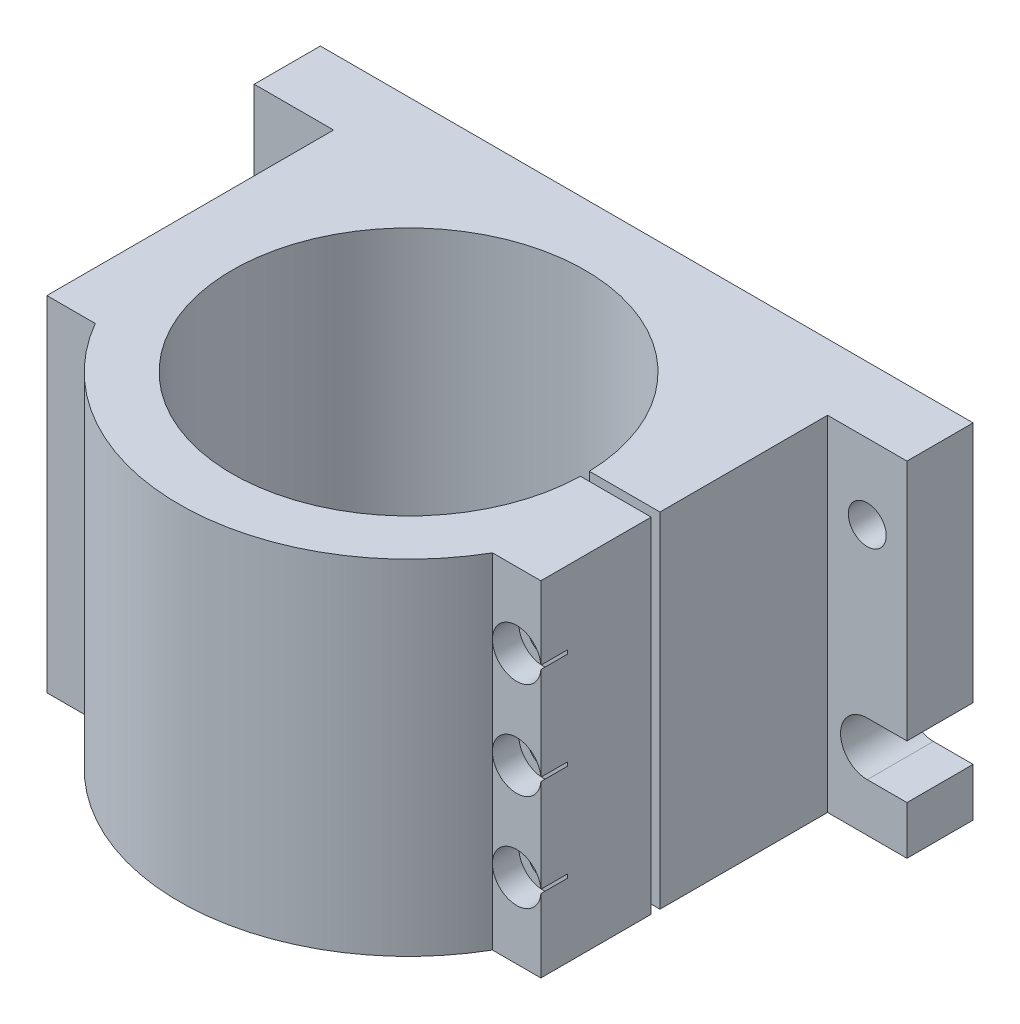
ISO-10303-21;
HEADER;
FILE_DESCRIPTION(('STEP AP214'),'2;1');
FILE_NAME('part.step','',(''),(''),'','','');
FILE_SCHEMA(('AUTOMOTIVE_DESIGN { 1 0 10303 214 1 1 1 1 }'));
ENDSEC;
DATA;
#1=APPLICATION_CONTEXT('core data for automotive mechanical design processes');
#2=APPLICATION_PROTOCOL_DEFINITION('international standard','automotive_design',2000,#1);
#3=PRODUCT_CONTEXT('',#1,'mechanical');
#4=PRODUCT('Part','Part','',(#3));
#5=PRODUCT_RELATED_PRODUCT_CATEGORY('part','',(#4));
#6=PRODUCT_DEFINITION_FORMATION('','',#4);
#7=PRODUCT_DEFINITION_CONTEXT('part definition',#1,'design');
#8=PRODUCT_DEFINITION('design','',#6,#7);
#9=PRODUCT_DEFINITION_SHAPE('','',#8);
#10=(LENGTH_UNIT() NAMED_UNIT(*) SI_UNIT(.MILLI.,.METRE.));
#11=(NAMED_UNIT(*) PLANE_ANGLE_UNIT() SI_UNIT($,.RADIAN.));
#12=(NAMED_UNIT(*) SI_UNIT($,.STERADIAN.) SOLID_ANGLE_UNIT());
#13=UNCERTAINTY_MEASURE_WITH_UNIT(LENGTH_MEASURE(1.E-05),#10,'distance_accuracy_value','');
#14=(GEOMETRIC_REPRESENTATION_CONTEXT(3) GLOBAL_UNCERTAINTY_ASSIGNED_CONTEXT((#13)) GLOBAL_UNIT_ASSIGNED_CONTEXT((#10,
#11,#12)) REPRESENTATION_CONTEXT('',''));
#15=CARTESIAN_POINT('',(0.,0.,0.));
#16=DIRECTION('',(0.,0.,1.));
#17=DIRECTION('',(1.,0.,0.));
#18=AXIS2_PLACEMENT_3D('',#15,#16,#17);
#19=CARTESIAN_POINT('',(74.,39.,-54.));
#20=DIRECTION('',(-1.,0.,0.));
#21=DIRECTION('',(0.,0.,1.));
#22=AXIS2_PLACEMENT_3D('',#19,#20,#21);
#23=PLANE('',#22);
#24=DIRECTION('',(0.,-1.,0.));
#25=VECTOR('',#24,1.);
#26=CARTESIAN_POINT('',(74.,39.,-39.));
#27=LINE('',#26,#25);
#28=CARTESIAN_POINT('',(74.,39.,-39.));
#29=VERTEX_POINT('',#28);
#30=CARTESIAN_POINT('',(74.,-15.95,-39.));
#31=VERTEX_POINT('',#30);
#32=EDGE_CURVE('E399',#29,#31,#27,.T.);
#33=ORIENTED_EDGE('',*,*,#32,.T.);
#34=DIRECTION('',(0.,0.,1.));
#35=VECTOR('',#34,1.);
#36=CARTESIAN_POINT('',(74.,-15.95,-54.001));
#37=LINE('',#36,#35);
#38=CARTESIAN_POINT('',(74.,-15.95,-54.));
#39=VERTEX_POINT('',#38);
#40=EDGE_CURVE('E250',#39,#31,#37,.T.);
#41=ORIENTED_EDGE('',*,*,#40,.F.);
#42=DIRECTION('',(0.,-1.,0.));
#43=VECTOR('',#42,1.);
#44=CARTESIAN_POINT('',(74.,39.,-54.));
#45=LINE('',#44,#43);
#46=CARTESIAN_POINT('',(74.,39.,-54.));
#47=VERTEX_POINT('',#46);
#48=EDGE_CURVE('E396',#47,#39,#45,.T.);
#49=ORIENTED_EDGE('',*,*,#48,.F.);
#50=DIRECTION('',(0.,0.,-1.));
#51=VECTOR('',#50,1.);
#52=CARTESIAN_POINT('',(74.,39.,-54.));
#53=LINE('',#52,#51);
#54=EDGE_CURVE('E363',#29,#47,#53,.T.);
#55=ORIENTED_EDGE('',*,*,#54,.F.);
#56=EDGE_LOOP('',(#33,#41,#49,#55));
#57=FACE_BOUND('',#56,.T.);
#58=ADVANCED_FACE('F37',(#57),#23,.F.);
#59=CARTESIAN_POINT('',(56.,39.,26.));
#60=DIRECTION('',(0.,0.,-1.));
#61=DIRECTION('',(-1.,0.,0.));
#62=AXIS2_PLACEMENT_3D('',#59,#60,#61);
#63=PLANE('',#62);
#64=DIRECTION('',(0.,-1.,0.));
#65=VECTOR('',#64,1.);
#66=CARTESIAN_POINT('',(45.0333209967908,39.,26.));
#67=LINE('',#66,#65);
#68=CARTESIAN_POINT('',(45.0333209967908,39.,26.));
#69=VERTEX_POINT('',#68);
#70=CARTESIAN_POINT('',(45.0333209967908,22.4277708617271,26.));
#71=VERTEX_POINT('',#70);
#72=EDGE_CURVE('E411',#69,#71,#67,.T.);
#73=ORIENTED_EDGE('',*,*,#72,.T.);
#74=CARTESIAN_POINT('',(50.5166604983954,22.,26.));
#75=DIRECTION('',(0.,0.,1.));
#76=DIRECTION('',(1.,0.,0.));
#77=AXIS2_PLACEMENT_3D('',#74,#75,#76);
#78=CIRCLE('',#77,5.5);
#79=CARTESIAN_POINT('',(56.,22.4277708617269,26.));
#80=VERTEX_POINT('',#79);
#81=EDGE_CURVE('E60',#80,#71,#78,.T.);
#82=ORIENTED_EDGE('',*,*,#81,.F.);
#83=DIRECTION('',(0.,-1.,0.));
#84=VECTOR('',#83,1.);
#85=CARTESIAN_POINT('',(56.,39.,26.));
#86=LINE('',#85,#84);
#87=CARTESIAN_POINT('',(56.,39.,26.));
#88=VERTEX_POINT('',#87);
#89=EDGE_CURVE('E406',#88,#80,#86,.T.);
#90=ORIENTED_EDGE('',*,*,#89,.F.);
#91=DIRECTION('',(1.,0.,0.));
#92=VECTOR('',#91,1.);
#93=CARTESIAN_POINT('',(56.,39.,26.));
#94=LINE('',#93,#92);
#95=EDGE_CURVE('E355',#69,#88,#94,.T.);
#96=ORIENTED_EDGE('',*,*,#95,.F.);
#97=EDGE_LOOP('',(#73,#82,#90,#96));
#98=FACE_BOUND('',#97,.T.);
#99=ADVANCED_FACE('F476',(#98),#63,.F.);
#100=CARTESIAN_POINT('',(56.,21.5722291382731,26.));
#101=VERTEX_POINT('',#100);
#102=CARTESIAN_POINT('',(56.,0.427770861726898,26.));
#103=VERTEX_POINT('',#102);
#104=EDGE_CURVE('E410',#101,#103,#86,.T.);
#105=ORIENTED_EDGE('',*,*,#104,.F.);
#106=CARTESIAN_POINT('',(45.0333209967908,21.5722291382729,26.));
#107=VERTEX_POINT('',#106);
#108=EDGE_CURVE('E260',#107,#101,#78,.T.);
#109=ORIENTED_EDGE('',*,*,#108,.F.);
#110=CARTESIAN_POINT('',(45.0333209967908,0.427770861727076,26.));
#111=VERTEX_POINT('',#110);
#112=EDGE_CURVE('E416',#107,#111,#67,.T.);
#113=ORIENTED_EDGE('',*,*,#112,.T.);
#114=CARTESIAN_POINT('',(50.5166604983954,0.,26.));
#115=DIRECTION('',(0.,0.,1.));
#116=DIRECTION('',(1.,0.,0.));
#117=AXIS2_PLACEMENT_3D('',#114,#115,#116);
#118=CIRCLE('',#117,5.5);
#119=EDGE_CURVE('E279',#103,#111,#118,.T.);
#120=ORIENTED_EDGE('',*,*,#119,.F.);
#121=EDGE_LOOP('',(#105,#109,#113,#120));
#122=FACE_BOUND('',#121,.T.);
#123=ADVANCED_FACE('F544',(#122),#63,.F.);
#124=CARTESIAN_POINT('',(56.,-0.427770861726898,26.));
#125=VERTEX_POINT('',#124);
#126=CARTESIAN_POINT('',(56.,-21.5722291382731,26.));
#127=VERTEX_POINT('',#126);
#128=EDGE_CURVE('E441',#125,#127,#86,.T.);
#129=ORIENTED_EDGE('',*,*,#128,.F.);
#130=CARTESIAN_POINT('',(45.0333209967908,-0.427770861727076,26.));
#131=VERTEX_POINT('',#130);
#132=EDGE_CURVE('E278',#131,#125,#118,.T.);
#133=ORIENTED_EDGE('',*,*,#132,.F.);
#134=CARTESIAN_POINT('',(45.0333209967908,-21.5722291382729,26.));
#135=VERTEX_POINT('',#134);
#136=EDGE_CURVE('E484',#131,#135,#67,.T.);
#137=ORIENTED_EDGE('',*,*,#136,.T.);
#138=CARTESIAN_POINT('',(50.5166604983954,-22.,26.));
#139=DIRECTION('',(0.,0.,1.));
#140=DIRECTION('',(1.,0.,0.));
#141=AXIS2_PLACEMENT_3D('',#138,#139,#140);
#142=CIRCLE('',#141,5.5);
#143=EDGE_CURVE('E296',#127,#135,#142,.T.);
#144=ORIENTED_EDGE('',*,*,#143,.F.);
#145=EDGE_LOOP('',(#129,#133,#137,#144));
#146=FACE_BOUND('',#145,.T.);
#147=ADVANCED_FACE('F448',(#146),#63,.F.);
#148=CARTESIAN_POINT('',(0.,39.,0.));
#149=DIRECTION('',(0.,-1.,0.));
#150=DIRECTION('',(0.,0.,-1.));
#151=AXIS2_PLACEMENT_3D('',#148,#149,#150);
#152=PLANE('',#151);
#153=DIRECTION('',(-1.,0.,0.));
#154=VECTOR('',#153,1.);
#155=CARTESIAN_POINT('',(0.,39.,1.));
#156=LINE('',#155,#154);
#157=CARTESIAN_POINT('',(56.,39.,1.));
#158=VERTEX_POINT('',#157);
#159=CARTESIAN_POINT('',(39.9874980462644,39.,1.));
#160=VERTEX_POINT('',#159);
#161=EDGE_CURVE('E325',#158,#160,#156,.T.);
#162=ORIENTED_EDGE('',*,*,#161,.T.);
#163=CARTESIAN_POINT('',(0.,39.,0.));
#164=DIRECTION('',(0.,1.,0.));
#165=DIRECTION('',(0.,0.,1.));
#166=AXIS2_PLACEMENT_3D('',#163,#164,#165);
#167=CIRCLE('',#166,40.);
#168=CARTESIAN_POINT('',(39.9874980462644,39.,-1.));
#169=VERTEX_POINT('',#168);
#170=EDGE_CURVE('E337',#169,#160,#167,.T.);
#171=ORIENTED_EDGE('',*,*,#170,.F.);
#172=DIRECTION('',(1.,0.,0.));
#173=VECTOR('',#172,1.);
#174=CARTESIAN_POINT('',(0.,39.,-1.));
#175=LINE('',#174,#173);
#176=CARTESIAN_POINT('',(56.,39.,-1.));
#177=VERTEX_POINT('',#176);
#178=EDGE_CURVE('E333',#169,#177,#175,.T.);
#179=ORIENTED_EDGE('',*,*,#178,.T.);
#180=DIRECTION('',(0.,0.,-1.));
#181=VECTOR('',#180,1.);
#182=CARTESIAN_POINT('',(56.,39.,-39.));
#183=LINE('',#182,#181);
#184=CARTESIAN_POINT('',(56.,39.,-39.));
#185=VERTEX_POINT('',#184);
#186=EDGE_CURVE('E357',#177,#185,#183,.T.);
#187=ORIENTED_EDGE('',*,*,#186,.T.);
#188=DIRECTION('',(1.,0.,0.));
#189=VECTOR('',#188,1.);
#190=CARTESIAN_POINT('',(74.,39.,-39.));
#191=LINE('',#190,#189);
#192=EDGE_CURVE('E361',#185,#29,#191,.T.);
#193=ORIENTED_EDGE('',*,*,#192,.T.);
#194=ORIENTED_EDGE('',*,*,#54,.T.);
#195=DIRECTION('',(-1.,0.,0.));
#196=VECTOR('',#195,1.);
#197=CARTESIAN_POINT('',(-74.,39.,-54.));
#198=LINE('',#197,#196);
#199=CARTESIAN_POINT('',(-74.,39.,-54.));
#200=VERTEX_POINT('',#199);
#201=EDGE_CURVE('E365',#47,#200,#198,.T.);
#202=ORIENTED_EDGE('',*,*,#201,.T.);
#203=DIRECTION('',(0.,0.,1.));
#204=VECTOR('',#203,1.);
#205=CARTESIAN_POINT('',(-74.,39.,-54.));
#206=LINE('',#205,#204);
#207=CARTESIAN_POINT('',(-74.,39.,-39.));
#208=VERTEX_POINT('',#207);
#209=EDGE_CURVE('E343',#200,#208,#206,.T.);
#210=ORIENTED_EDGE('',*,*,#209,.T.);
#211=DIRECTION('',(1.,0.,0.));
#212=VECTOR('',#211,1.);
#213=CARTESIAN_POINT('',(-74.,39.,-39.));
#214=LINE('',#213,#212);
#215=CARTESIAN_POINT('',(-56.,39.,-39.));
#216=VERTEX_POINT('',#215);
#217=EDGE_CURVE('E346',#208,#216,#214,.T.);
#218=ORIENTED_EDGE('',*,*,#217,.T.);
#219=DIRECTION('',(0.,0.,1.));
#220=VECTOR('',#219,1.);
#221=CARTESIAN_POINT('',(-56.,39.,-39.));
#222=LINE('',#221,#220);
#223=CARTESIAN_POINT('',(-56.,39.,26.));
#224=VERTEX_POINT('',#223);
#225=EDGE_CURVE('E349',#216,#224,#222,.T.);
#226=ORIENTED_EDGE('',*,*,#225,.T.);
#227=DIRECTION('',(1.,0.,0.));
#228=VECTOR('',#227,1.);
#229=CARTESIAN_POINT('',(-56.,39.,26.));
#230=LINE('',#229,#228);
#231=CARTESIAN_POINT('',(-45.0333209967908,39.,26.));
#232=VERTEX_POINT('',#231);
#233=EDGE_CURVE('E351',#224,#232,#230,.T.);
#234=ORIENTED_EDGE('',*,*,#233,.T.);
#235=CARTESIAN_POINT('',(0.,39.,0.));
#236=DIRECTION('',(0.,1.,0.));
#237=DIRECTION('',(0.,0.,-1.));
#238=AXIS2_PLACEMENT_3D('',#235,#236,#237);
#239=CIRCLE('',#238,52.);
#240=EDGE_CURVE('E353',#232,#69,#239,.T.);
#241=ORIENTED_EDGE('',*,*,#240,.T.);
#242=ORIENTED_EDGE('',*,*,#95,.T.);
#243=EDGE_CURVE('E358',#88,#158,#183,.T.);
#244=ORIENTED_EDGE('',*,*,#243,.T.);
#245=EDGE_LOOP('',(#162,#171,#179,#187,#193,#194,#202,#210,#218,#226,#234,#241,#242,#244));
#246=FACE_BOUND('',#245,.T.);
#247=ADVANCED_FACE('F470',(#246),#152,.F.);
#248=CARTESIAN_POINT('',(0.,-39.,0.));
#249=DIRECTION('',(0.,-1.,0.));
#250=DIRECTION('',(0.,0.,-1.));
#251=AXIS2_PLACEMENT_3D('',#248,#249,#250);
#252=PLANE('',#251);
#253=CARTESIAN_POINT('',(0.,-39.,0.));
#254=DIRECTION('',(0.,1.,0.));
#255=DIRECTION('',(0.,0.,1.));
#256=AXIS2_PLACEMENT_3D('',#253,#254,#255);
#257=CIRCLE('',#256,40.);
#258=CARTESIAN_POINT('',(39.9874980462644,-39.,-1.));
#259=VERTEX_POINT('',#258);
#260=CARTESIAN_POINT('',(39.9874980462644,-39.,1.));
#261=VERTEX_POINT('',#260);
#262=EDGE_CURVE('E336',#259,#261,#257,.T.);
#263=ORIENTED_EDGE('',*,*,#262,.T.);
#264=DIRECTION('',(1.,0.,0.));
#265=VECTOR('',#264,1.);
#266=CARTESIAN_POINT('',(0.,-39.,1.));
#267=LINE('',#266,#265);
#268=CARTESIAN_POINT('',(56.,-39.,1.));
#269=VERTEX_POINT('',#268);
#270=EDGE_CURVE('E318',#261,#269,#267,.T.);
#271=ORIENTED_EDGE('',*,*,#270,.T.);
#272=DIRECTION('',(0.,0.,-1.));
#273=VECTOR('',#272,1.);
#274=CARTESIAN_POINT('',(56.,-39.,-39.));
#275=LINE('',#274,#273);
#276=CARTESIAN_POINT('',(56.,-39.,26.));
#277=VERTEX_POINT('',#276);
#278=EDGE_CURVE('E383',#277,#269,#275,.T.);
#279=ORIENTED_EDGE('',*,*,#278,.F.);
#280=DIRECTION('',(1.,0.,0.));
#281=VECTOR('',#280,1.);
#282=CARTESIAN_POINT('',(56.,-39.,26.));
#283=LINE('',#282,#281);
#284=CARTESIAN_POINT('',(45.0333209967908,-39.,26.));
#285=VERTEX_POINT('',#284);
#286=EDGE_CURVE('E379',#285,#277,#283,.T.);
#287=ORIENTED_EDGE('',*,*,#286,.F.);
#288=CARTESIAN_POINT('',(0.,-39.,0.));
#289=DIRECTION('',(0.,1.,0.));
#290=DIRECTION('',(0.,0.,-1.));
#291=AXIS2_PLACEMENT_3D('',#288,#289,#290);
#292=CIRCLE('',#291,52.);
#293=CARTESIAN_POINT('',(-45.0333209967908,-39.,26.));
#294=VERTEX_POINT('',#293);
#295=EDGE_CURVE('E376',#294,#285,#292,.T.);
#296=ORIENTED_EDGE('',*,*,#295,.F.);
#297=DIRECTION('',(1.,0.,0.));
#298=VECTOR('',#297,1.);
#299=CARTESIAN_POINT('',(-56.,-39.,26.));
#300=LINE('',#299,#298);
#301=CARTESIAN_POINT('',(-56.,-39.,26.));
#302=VERTEX_POINT('',#301);
#303=EDGE_CURVE('E374',#302,#294,#300,.T.);
#304=ORIENTED_EDGE('',*,*,#303,.F.);
#305=DIRECTION('',(0.,0.,1.));
#306=VECTOR('',#305,1.);
#307=CARTESIAN_POINT('',(-56.,-39.,-39.));
#308=LINE('',#307,#306);
#309=CARTESIAN_POINT('',(-56.,-39.,-39.));
#310=VERTEX_POINT('',#309);
#311=EDGE_CURVE('E372',#310,#302,#308,.T.);
#312=ORIENTED_EDGE('',*,*,#311,.F.);
#313=DIRECTION('',(1.,0.,0.));
#314=VECTOR('',#313,1.);
#315=CARTESIAN_POINT('',(-74.,-39.,-39.));
#316=LINE('',#315,#314);
#317=CARTESIAN_POINT('',(-74.,-39.,-39.));
#318=VERTEX_POINT('',#317);
#319=EDGE_CURVE('E370',#318,#310,#316,.T.);
#320=ORIENTED_EDGE('',*,*,#319,.F.);
#321=DIRECTION('',(0.,0.,1.));
#322=VECTOR('',#321,1.);
#323=CARTESIAN_POINT('',(-74.,-39.,-54.));
#324=LINE('',#323,#322);
#325=CARTESIAN_POINT('',(-74.,-39.,-54.));
#326=VERTEX_POINT('',#325);
#327=EDGE_CURVE('E340',#326,#318,#324,.T.);
#328=ORIENTED_EDGE('',*,*,#327,.F.);
#329=DIRECTION('',(-1.,0.,0.));
#330=VECTOR('',#329,1.);
#331=CARTESIAN_POINT('',(-74.,-39.,-54.));
#332=LINE('',#331,#330);
#333=CARTESIAN_POINT('',(74.,-39.,-54.));
#334=VERTEX_POINT('',#333);
#335=EDGE_CURVE('E347',#334,#326,#332,.T.);
#336=ORIENTED_EDGE('',*,*,#335,.F.);
#337=DIRECTION('',(0.,0.,-1.));
#338=VECTOR('',#337,1.);
#339=CARTESIAN_POINT('',(74.,-39.,-54.));
#340=LINE('',#339,#338);
#341=CARTESIAN_POINT('',(74.,-39.,-39.));
#342=VERTEX_POINT('',#341);
#343=EDGE_CURVE('E389',#342,#334,#340,.T.);
#344=ORIENTED_EDGE('',*,*,#343,.F.);
#345=DIRECTION('',(1.,0.,0.));
#346=VECTOR('',#345,1.);
#347=CARTESIAN_POINT('',(74.,-39.,-39.));
#348=LINE('',#347,#346);
#349=CARTESIAN_POINT('',(56.,-39.,-39.));
#350=VERTEX_POINT('',#349);
#351=EDGE_CURVE('E386',#350,#342,#348,.T.);
#352=ORIENTED_EDGE('',*,*,#351,.F.);
#353=CARTESIAN_POINT('',(56.,-39.,-1.));
#354=VERTEX_POINT('',#353);
#355=EDGE_CURVE('E382',#354,#350,#275,.T.);
#356=ORIENTED_EDGE('',*,*,#355,.F.);
#357=DIRECTION('',(-1.,0.,0.));
#358=VECTOR('',#357,1.);
#359=CARTESIAN_POINT('',(0.,-39.,-1.));
#360=LINE('',#359,#358);
#361=EDGE_CURVE('E315',#354,#259,#360,.T.);
#362=ORIENTED_EDGE('',*,*,#361,.T.);
#363=EDGE_LOOP('',(#263,#271,#279,#287,#296,#304,#312,#320,#328,#336,#344,#352,#356,#362));
#364=FACE_BOUND('',#363,.T.);
#365=ADVANCED_FACE('F460',(#364),#252,.T.);
#366=CARTESIAN_POINT('',(56.,39.,-39.));
#367=DIRECTION('',(-1.,0.,0.));
#368=DIRECTION('',(0.,0.,1.));
#369=AXIS2_PLACEMENT_3D('',#366,#367,#368);
#370=PLANE('',#369);
#371=DIRECTION('',(0.,-1.,0.));
#372=VECTOR('',#371,1.);
#373=CARTESIAN_POINT('',(56.,39.,20.));
#374=LINE('',#373,#372);
#375=CARTESIAN_POINT('',(56.,22.4277708617269,20.));
#376=VERTEX_POINT('',#375);
#377=CARTESIAN_POINT('',(56.,21.5722291382731,20.));
#378=VERTEX_POINT('',#377);
#379=EDGE_CURVE('E11',#376,#378,#374,.T.);
#380=ORIENTED_EDGE('',*,*,#379,.T.);
#381=DIRECTION('',(0.,0.,1.));
#382=VECTOR('',#381,1.);
#383=CARTESIAN_POINT('',(56.,21.5722291382731,26.));
#384=LINE('',#383,#382);
#385=EDGE_CURVE('E275',#378,#101,#384,.T.);
#386=ORIENTED_EDGE('',*,*,#385,.T.);
#387=ORIENTED_EDGE('',*,*,#104,.T.);
#388=DIRECTION('',(0.,0.,1.));
#389=VECTOR('',#388,1.);
#390=CARTESIAN_POINT('',(56.,0.427770861726898,26.));
#391=LINE('',#390,#389);
#392=CARTESIAN_POINT('',(56.,0.427770861726898,20.));
#393=VERTEX_POINT('',#392);
#394=EDGE_CURVE('E432',#103,#393,#391,.F.);
#395=ORIENTED_EDGE('',*,*,#394,.T.);
#396=DIRECTION('',(0.,-1.,0.));
#397=VECTOR('',#396,1.);
#398=CARTESIAN_POINT('',(56.,39.,20.));
#399=LINE('',#398,#397);
#400=CARTESIAN_POINT('',(56.,-0.427770861726898,20.));
#401=VERTEX_POINT('',#400);
#402=EDGE_CURVE('E435',#393,#401,#399,.T.);
#403=ORIENTED_EDGE('',*,*,#402,.T.);
#404=DIRECTION('',(0.,0.,1.));
#405=VECTOR('',#404,1.);
#406=CARTESIAN_POINT('',(56.,-0.427770861726898,26.));
#407=LINE('',#406,#405);
#408=EDGE_CURVE('E45',#401,#125,#407,.T.);
#409=ORIENTED_EDGE('',*,*,#408,.T.);
#410=ORIENTED_EDGE('',*,*,#128,.T.);
#411=DIRECTION('',(0.,0.,1.));
#412=VECTOR('',#411,1.);
#413=CARTESIAN_POINT('',(56.,-21.5722291382731,26.));
#414=LINE('',#413,#412);
#415=CARTESIAN_POINT('',(56.,-21.5722291382731,20.));
#416=VERTEX_POINT('',#415);
#417=EDGE_CURVE('E309',#127,#416,#414,.F.);
#418=ORIENTED_EDGE('',*,*,#417,.T.);
#419=DIRECTION('',(0.,-1.,0.));
#420=VECTOR('',#419,1.);
#421=CARTESIAN_POINT('',(56.,39.,20.));
#422=LINE('',#421,#420);
#423=CARTESIAN_POINT('',(56.,-22.4277708617269,20.));
#424=VERTEX_POINT('',#423);
#425=EDGE_CURVE('E429',#416,#424,#422,.T.);
#426=ORIENTED_EDGE('',*,*,#425,.T.);
#427=DIRECTION('',(0.,0.,1.));
#428=VECTOR('',#427,1.);
#429=CARTESIAN_POINT('',(56.,-22.4277708617269,26.));
#430=LINE('',#429,#428);
#431=CARTESIAN_POINT('',(56.,-22.4277708617269,26.));
#432=VERTEX_POINT('',#431);
#433=EDGE_CURVE('E312',#424,#432,#430,.T.);
#434=ORIENTED_EDGE('',*,*,#433,.T.);
#435=EDGE_CURVE('E405',#432,#277,#86,.T.);
#436=ORIENTED_EDGE('',*,*,#435,.T.);
#437=ORIENTED_EDGE('',*,*,#278,.T.);
#438=DIRECTION('',(0.,-1.,0.));
#439=VECTOR('',#438,1.);
#440=CARTESIAN_POINT('',(56.,39.001,1.));
#441=LINE('',#440,#439);
#442=EDGE_CURVE('E331',#158,#269,#441,.T.);
#443=ORIENTED_EDGE('',*,*,#442,.F.);
#444=ORIENTED_EDGE('',*,*,#243,.F.);
#445=ORIENTED_EDGE('',*,*,#89,.T.);
#446=DIRECTION('',(0.,0.,1.));
#447=VECTOR('',#446,1.);
#448=CARTESIAN_POINT('',(56.,22.4277708617269,26.));
#449=LINE('',#448,#447);
#450=EDGE_CURVE('E272',#80,#376,#449,.F.);
#451=ORIENTED_EDGE('',*,*,#450,.T.);
#452=EDGE_LOOP('',(#380,#386,#387,#395,#403,#409,#410,#418,#426,#434,#436,#437,#443,#444,#445,#451));
#453=FACE_BOUND('',#452,.T.);
#454=ADVANCED_FACE('F440',(#453),#370,.F.);
#455=DIRECTION('',(0.,-1.,0.));
#456=VECTOR('',#455,1.);
#457=CARTESIAN_POINT('',(56.,39.001,-1.));
#458=LINE('',#457,#456);
#459=EDGE_CURVE('E328',#177,#354,#458,.T.);
#460=ORIENTED_EDGE('',*,*,#459,.T.);
#461=ORIENTED_EDGE('',*,*,#355,.T.);
#462=DIRECTION('',(0.,-1.,0.));
#463=VECTOR('',#462,1.);
#464=CARTESIAN_POINT('',(56.,39.,-39.));
#465=LINE('',#464,#463);
#466=EDGE_CURVE('E402',#185,#350,#465,.T.);
#467=ORIENTED_EDGE('',*,*,#466,.F.);
#468=ORIENTED_EDGE('',*,*,#186,.F.);
#469=EDGE_LOOP('',(#460,#461,#467,#468));
#470=FACE_BOUND('',#469,.T.);
#471=ADVANCED_FACE('F523',(#470),#370,.F.);
#472=CARTESIAN_POINT('',(0.,39.,0.));
#473=DIRECTION('',(0.,-1.,0.));
#474=DIRECTION('',(0.,0.,-1.));
#475=AXIS2_PLACEMENT_3D('',#472,#473,#474);
#476=CYLINDRICAL_SURFACE('',#475,40.);
#477=ORIENTED_EDGE('',*,*,#170,.T.);
#478=DIRECTION('',(0.,-1.,0.));
#479=VECTOR('',#478,1.);
#480=CARTESIAN_POINT('',(39.9874980462644,39.,1.));
#481=LINE('',#480,#479);
#482=EDGE_CURVE('E323',#261,#160,#481,.F.);
#483=ORIENTED_EDGE('',*,*,#482,.F.);
#484=ORIENTED_EDGE('',*,*,#262,.F.);
#485=DIRECTION('',(0.,-1.,0.));
#486=VECTOR('',#485,1.);
#487=CARTESIAN_POINT('',(39.9874980462644,39.,-1.));
#488=LINE('',#487,#486);
#489=EDGE_CURVE('E321',#169,#259,#488,.T.);
#490=ORIENTED_EDGE('',*,*,#489,.F.);
#491=EDGE_LOOP('',(#477,#483,#484,#490));
#492=FACE_BOUND('',#491,.T.);
#493=ADVANCED_FACE('F466',(#492),#476,.F.);
#494=CARTESIAN_POINT('',(-74.,39.,-54.));
#495=DIRECTION('',(1.,0.,0.));
#496=DIRECTION('',(0.,0.,-1.));
#497=AXIS2_PLACEMENT_3D('',#494,#495,#496);
#498=PLANE('',#497);
#499=ORIENTED_EDGE('',*,*,#327,.T.);
#500=DIRECTION('',(0.,-1.,0.));
#501=VECTOR('',#500,1.);
#502=CARTESIAN_POINT('',(-74.,39.,-39.));
#503=LINE('',#502,#501);
#504=EDGE_CURVE('E426',#208,#318,#503,.T.);
#505=ORIENTED_EDGE('',*,*,#504,.F.);
#506=ORIENTED_EDGE('',*,*,#209,.F.);
#507=DIRECTION('',(0.,-1.,0.));
#508=VECTOR('',#507,1.);
#509=CARTESIAN_POINT('',(-74.,39.,-54.));
#510=LINE('',#509,#508);
#511=EDGE_CURVE('E367',#200,#326,#510,.T.);
#512=ORIENTED_EDGE('',*,*,#511,.T.);
#513=EDGE_LOOP('',(#499,#505,#506,#512));
#514=FACE_BOUND('',#513,.T.);
#515=ADVANCED_FACE('F39',(#514),#498,.F.);
#516=CARTESIAN_POINT('',(-74.,39.,-39.));
#517=DIRECTION('',(0.,0.,-1.));
#518=DIRECTION('',(-1.,0.,0.));
#519=AXIS2_PLACEMENT_3D('',#516,#517,#518);
#520=PLANE('',#519);
#521=CARTESIAN_POINT('',(-65.,22.,-39.));
#522=DIRECTION('',(0.,0.,1.));
#523=DIRECTION('',(1.,0.,0.));
#524=AXIS2_PLACEMENT_3D('',#521,#522,#523);
#525=CIRCLE('',#524,5.05);
#526=CARTESIAN_POINT('',(-59.95,22.,-39.));
#527=VERTEX_POINT('',#526);
#528=EDGE_CURVE('E232',#527,#527,#525,.T.);
#529=ORIENTED_EDGE('',*,*,#528,.F.);
#530=EDGE_LOOP('',(#529));
#531=FACE_BOUND('',#530,.T.);
#532=CARTESIAN_POINT('',(-65.,-22.,-39.));
#533=DIRECTION('',(0.,0.,1.));
#534=DIRECTION('',(1.,0.,0.));
#535=AXIS2_PLACEMENT_3D('',#532,#533,#534);
#536=CIRCLE('',#535,4.3);
#537=CARTESIAN_POINT('',(-60.7,-22.,-39.));
#538=VERTEX_POINT('',#537);
#539=EDGE_CURVE('E574',#538,#538,#536,.T.);
#540=ORIENTED_EDGE('',*,*,#539,.F.);
#541=EDGE_LOOP('',(#540));
#542=FACE_BOUND('',#541,.T.);
#543=ORIENTED_EDGE('',*,*,#319,.T.);
#544=DIRECTION('',(0.,-1.,0.));
#545=VECTOR('',#544,1.);
#546=CARTESIAN_POINT('',(-56.,39.,-39.));
#547=LINE('',#546,#545);
#548=EDGE_CURVE('E423',#216,#310,#547,.T.);
#549=ORIENTED_EDGE('',*,*,#548,.F.);
#550=ORIENTED_EDGE('',*,*,#217,.F.);
#551=ORIENTED_EDGE('',*,*,#504,.T.);
#552=EDGE_LOOP('',(#543,#549,#550,#551));
#553=FACE_BOUND('',#552,.T.);
#554=ADVANCED_FACE('F503',(#531,#542,#553),#520,.F.);
#555=CARTESIAN_POINT('',(-56.,39.,-39.));
#556=DIRECTION('',(1.,0.,0.));
#557=DIRECTION('',(0.,0.,-1.));
#558=AXIS2_PLACEMENT_3D('',#555,#556,#557);
#559=PLANE('',#558);
#560=ORIENTED_EDGE('',*,*,#311,.T.);
#561=DIRECTION('',(0.,-1.,0.));
#562=VECTOR('',#561,1.);
#563=CARTESIAN_POINT('',(-56.,39.,26.));
#564=LINE('',#563,#562);
#565=EDGE_CURVE('E420',#224,#302,#564,.T.);
#566=ORIENTED_EDGE('',*,*,#565,.F.);
#567=ORIENTED_EDGE('',*,*,#225,.F.);
#568=ORIENTED_EDGE('',*,*,#548,.T.);
#569=EDGE_LOOP('',(#560,#566,#567,#568));
#570=FACE_BOUND('',#569,.T.);
#571=ADVANCED_FACE('F500',(#570),#559,.F.);
#572=CARTESIAN_POINT('',(-56.,39.,26.));
#573=DIRECTION('',(0.,0.,-1.));
#574=DIRECTION('',(-1.,0.,0.));
#575=AXIS2_PLACEMENT_3D('',#572,#573,#574);
#576=PLANE('',#575);
#577=ORIENTED_EDGE('',*,*,#303,.T.);
#578=DIRECTION('',(0.,-1.,0.));
#579=VECTOR('',#578,1.);
#580=CARTESIAN_POINT('',(-45.0333209967908,39.,26.));
#581=LINE('',#580,#579);
#582=EDGE_CURVE('E414',#232,#294,#581,.T.);
#583=ORIENTED_EDGE('',*,*,#582,.F.);
#584=ORIENTED_EDGE('',*,*,#233,.F.);
#585=ORIENTED_EDGE('',*,*,#565,.T.);
#586=EDGE_LOOP('',(#577,#583,#584,#585));
#587=FACE_BOUND('',#586,.T.);
#588=ADVANCED_FACE('F495',(#587),#576,.F.);
#589=CARTESIAN_POINT('',(0.,39.,0.));
#590=DIRECTION('',(0.,-1.,0.));
#591=DIRECTION('',(0.,0.,-1.));
#592=AXIS2_PLACEMENT_3D('',#589,#590,#591);
#593=CYLINDRICAL_SURFACE('',#592,52.);
#594=ORIENTED_EDGE('',*,*,#295,.T.);
#595=CARTESIAN_POINT('',(45.0333209967908,-22.4277708617271,26.));
#596=VERTEX_POINT('',#595);
#597=EDGE_CURVE('E409',#596,#285,#67,.T.);
#598=ORIENTED_EDGE('',*,*,#597,.F.);
#599=EDGE_CURVE('E417',#135,#596,#67,.T.);
#600=ORIENTED_EDGE('',*,*,#599,.F.);
#601=ORIENTED_EDGE('',*,*,#136,.F.);
#602=DIRECTION('',(0.,-1.,0.));
#603=VECTOR('',#602,1.);
#604=CARTESIAN_POINT('',(45.0333209967908,39.,26.));
#605=LINE('',#604,#603);
#606=EDGE_CURVE('E292',#131,#111,#605,.F.);
#607=ORIENTED_EDGE('',*,*,#606,.T.);
#608=ORIENTED_EDGE('',*,*,#112,.F.);
#609=EDGE_CURVE('E415',#71,#107,#67,.T.);
#610=ORIENTED_EDGE('',*,*,#609,.F.);
#611=ORIENTED_EDGE('',*,*,#72,.F.);
#612=ORIENTED_EDGE('',*,*,#240,.F.);
#613=ORIENTED_EDGE('',*,*,#582,.T.);
#614=EDGE_LOOP('',(#594,#598,#600,#601,#607,#608,#610,#611,#612,#613));
#615=FACE_BOUND('',#614,.T.);
#616=ADVANCED_FACE('F481',(#615),#593,.T.);
#617=ORIENTED_EDGE('',*,*,#435,.F.);
#618=EDGE_CURVE('E295',#596,#432,#142,.T.);
#619=ORIENTED_EDGE('',*,*,#618,.F.);
#620=ORIENTED_EDGE('',*,*,#597,.T.);
#621=ORIENTED_EDGE('',*,*,#286,.T.);
#622=EDGE_LOOP('',(#617,#619,#620,#621));
#623=FACE_BOUND('',#622,.T.);
#624=ADVANCED_FACE('F456',(#623),#63,.F.);
#625=CARTESIAN_POINT('',(74.,39.,-39.));
#626=DIRECTION('',(0.,0.,-1.));
#627=DIRECTION('',(-1.,0.,0.));
#628=AXIS2_PLACEMENT_3D('',#625,#626,#627);
#629=PLANE('',#628);
#630=CARTESIAN_POINT('',(65.,22.,-39.));
#631=DIRECTION('',(0.,0.,1.));
#632=DIRECTION('',(1.,0.,0.));
#633=AXIS2_PLACEMENT_3D('',#630,#631,#632);
#634=CIRCLE('',#633,4.3);
#635=CARTESIAN_POINT('',(69.3,22.,-39.));
#636=VERTEX_POINT('',#635);
#637=EDGE_CURVE('E253',#636,#636,#634,.T.);
#638=ORIENTED_EDGE('',*,*,#637,.F.);
#639=EDGE_LOOP('',(#638));
#640=FACE_BOUND('',#639,.T.);
#641=CARTESIAN_POINT('',(65.,-22.,-39.));
#642=DIRECTION('',(0.,0.,1.));
#643=DIRECTION('',(1.,0.,0.));
#644=AXIS2_PLACEMENT_3D('',#641,#642,#643);
#645=CIRCLE('',#644,6.05);
#646=CARTESIAN_POINT('',(65.,-15.95,-39.));
#647=VERTEX_POINT('',#646);
#648=CARTESIAN_POINT('',(65.,-28.05,-39.));
#649=VERTEX_POINT('',#648);
#650=EDGE_CURVE('E224',#647,#649,#645,.T.);
#651=ORIENTED_EDGE('',*,*,#650,.F.);
#652=DIRECTION('',(-1.,0.,0.));
#653=VECTOR('',#652,1.);
#654=CARTESIAN_POINT('',(65.,-15.95,-39.));
#655=LINE('',#654,#653);
#656=EDGE_CURVE('E226',#31,#647,#655,.T.);
#657=ORIENTED_EDGE('',*,*,#656,.F.);
#658=ORIENTED_EDGE('',*,*,#32,.F.);
#659=ORIENTED_EDGE('',*,*,#192,.F.);
#660=ORIENTED_EDGE('',*,*,#466,.T.);
#661=ORIENTED_EDGE('',*,*,#351,.T.);
#662=CARTESIAN_POINT('',(74.,-28.05,-39.));
#663=VERTEX_POINT('',#662);
#664=EDGE_CURVE('E398',#663,#342,#27,.T.);
#665=ORIENTED_EDGE('',*,*,#664,.F.);
#666=DIRECTION('',(1.,0.,0.));
#667=VECTOR('',#666,1.);
#668=CARTESIAN_POINT('',(74.,-28.05,-39.));
#669=LINE('',#668,#667);
#670=EDGE_CURVE('E245',#649,#663,#669,.T.);
#671=ORIENTED_EDGE('',*,*,#670,.F.);
#672=EDGE_LOOP('',(#651,#657,#658,#659,#660,#661,#665,#671));
#673=FACE_BOUND('',#672,.T.);
#674=ADVANCED_FACE('F518',(#640,#673),#629,.F.);
#675=CARTESIAN_POINT('',(74.,-28.05,-54.));
#676=VERTEX_POINT('',#675);
#677=EDGE_CURVE('E395',#676,#334,#45,.T.);
#678=ORIENTED_EDGE('',*,*,#677,.F.);
#679=DIRECTION('',(0.,0.,1.));
#680=VECTOR('',#679,1.);
#681=CARTESIAN_POINT('',(74.,-28.05,-54.001));
#682=LINE('',#681,#680);
#683=EDGE_CURVE('E52',#676,#663,#682,.T.);
#684=ORIENTED_EDGE('',*,*,#683,.T.);
#685=ORIENTED_EDGE('',*,*,#664,.T.);
#686=ORIENTED_EDGE('',*,*,#343,.T.);
#687=EDGE_LOOP('',(#678,#684,#685,#686));
#688=FACE_BOUND('',#687,.T.);
#689=ADVANCED_FACE('F513',(#688),#23,.F.);
#690=CARTESIAN_POINT('',(-74.,39.,-54.));
#691=DIRECTION('',(0.,0.,1.));
#692=DIRECTION('',(1.,0.,0.));
#693=AXIS2_PLACEMENT_3D('',#690,#691,#692);
#694=PLANE('',#693);
#695=CARTESIAN_POINT('',(-65.,22.,-54.));
#696=DIRECTION('',(0.,0.,1.));
#697=DIRECTION('',(1.,0.,0.));
#698=AXIS2_PLACEMENT_3D('',#695,#696,#697);
#699=CIRCLE('',#698,5.05);
#700=CARTESIAN_POINT('',(-59.95,22.,-54.));
#701=VERTEX_POINT('',#700);
#702=EDGE_CURVE('E241',#701,#701,#699,.F.);
#703=ORIENTED_EDGE('',*,*,#702,.F.);
#704=EDGE_LOOP('',(#703));
#705=FACE_BOUND('',#704,.T.);
#706=CARTESIAN_POINT('',(-65.,-22.,-54.));
#707=DIRECTION('',(0.,0.,1.));
#708=DIRECTION('',(1.,0.,0.));
#709=AXIS2_PLACEMENT_3D('',#706,#707,#708);
#710=CIRCLE('',#709,4.3);
#711=CARTESIAN_POINT('',(-60.7,-22.,-54.));
#712=VERTEX_POINT('',#711);
#713=EDGE_CURVE('E257',#712,#712,#710,.F.);
#714=ORIENTED_EDGE('',*,*,#713,.F.);
#715=EDGE_LOOP('',(#714));
#716=FACE_BOUND('',#715,.T.);
#717=CARTESIAN_POINT('',(65.,22.,-54.));
#718=DIRECTION('',(0.,0.,1.));
#719=DIRECTION('',(1.,0.,0.));
#720=AXIS2_PLACEMENT_3D('',#717,#718,#719);
#721=CIRCLE('',#720,4.3);
#722=CARTESIAN_POINT('',(69.3,22.,-54.));
#723=VERTEX_POINT('',#722);
#724=EDGE_CURVE('E256',#723,#723,#721,.F.);
#725=ORIENTED_EDGE('',*,*,#724,.F.);
#726=EDGE_LOOP('',(#725));
#727=FACE_BOUND('',#726,.T.);
#728=ORIENTED_EDGE('',*,*,#48,.T.);
#729=DIRECTION('',(1.,0.,0.));
#730=VECTOR('',#729,1.);
#731=CARTESIAN_POINT('',(65.,-15.95,-54.));
#732=LINE('',#731,#730);
#733=CARTESIAN_POINT('',(65.,-15.95,-54.));
#734=VERTEX_POINT('',#733);
#735=EDGE_CURVE('E237',#734,#39,#732,.T.);
#736=ORIENTED_EDGE('',*,*,#735,.F.);
#737=CARTESIAN_POINT('',(65.,-22.,-54.));
#738=DIRECTION('',(0.,0.,1.));
#739=DIRECTION('',(1.,0.,0.));
#740=AXIS2_PLACEMENT_3D('',#737,#738,#739);
#741=CIRCLE('',#740,6.05);
#742=CARTESIAN_POINT('',(65.,-28.05,-54.));
#743=VERTEX_POINT('',#742);
#744=EDGE_CURVE('E221',#743,#734,#741,.F.);
#745=ORIENTED_EDGE('',*,*,#744,.F.);
#746=DIRECTION('',(-1.,0.,0.));
#747=VECTOR('',#746,1.);
#748=CARTESIAN_POINT('',(74.,-28.05,-54.));
#749=LINE('',#748,#747);
#750=EDGE_CURVE('E228',#676,#743,#749,.T.);
#751=ORIENTED_EDGE('',*,*,#750,.F.);
#752=ORIENTED_EDGE('',*,*,#677,.T.);
#753=ORIENTED_EDGE('',*,*,#335,.T.);
#754=ORIENTED_EDGE('',*,*,#511,.F.);
#755=ORIENTED_EDGE('',*,*,#201,.F.);
#756=EDGE_LOOP('',(#728,#736,#745,#751,#752,#753,#754,#755));
#757=FACE_BOUND('',#756,.T.);
#758=ADVANCED_FACE('F236',(#705,#716,#727,#757),#694,.F.);
#759=CARTESIAN_POINT('',(0.,39.001,-1.));
#760=DIRECTION('',(0.,0.,1.));
#761=DIRECTION('',(1.,0.,0.));
#762=AXIS2_PLACEMENT_3D('',#759,#760,#761);
#763=PLANE('',#762);
#764=ORIENTED_EDGE('',*,*,#489,.T.);
#765=ORIENTED_EDGE('',*,*,#361,.F.);
#766=ORIENTED_EDGE('',*,*,#459,.F.);
#767=ORIENTED_EDGE('',*,*,#178,.F.);
#768=EDGE_LOOP('',(#764,#765,#766,#767));
#769=FACE_BOUND('',#768,.T.);
#770=ADVANCED_FACE('F525',(#769),#763,.T.);
#771=CARTESIAN_POINT('',(0.,39.001,1.));
#772=DIRECTION('',(0.,0.,-1.));
#773=DIRECTION('',(-1.,0.,0.));
#774=AXIS2_PLACEMENT_3D('',#771,#772,#773);
#775=PLANE('',#774);
#776=CARTESIAN_POINT('',(50.5166604983954,22.,1.));
#777=DIRECTION('',(0.,0.,-1.));
#778=DIRECTION('',(-1.,0.,0.));
#779=AXIS2_PLACEMENT_3D('',#776,#777,#778);
#780=CIRCLE('',#779,3.29999999999999);
#781=CARTESIAN_POINT('',(47.2166604983954,22.,1.));
#782=VERTEX_POINT('',#781);
#783=EDGE_CURVE('E269',#782,#782,#780,.T.);
#784=ORIENTED_EDGE('',*,*,#783,.F.);
#785=EDGE_LOOP('',(#784));
#786=FACE_BOUND('',#785,.T.);
#787=CARTESIAN_POINT('',(50.5166604983954,0.,1.));
#788=DIRECTION('',(0.,0.,-1.));
#789=DIRECTION('',(-1.,0.,0.));
#790=AXIS2_PLACEMENT_3D('',#787,#788,#789);
#791=CIRCLE('',#790,3.29999999999999);
#792=CARTESIAN_POINT('',(47.2166604983954,0.,1.));
#793=VERTEX_POINT('',#792);
#794=EDGE_CURVE('E289',#793,#793,#791,.T.);
#795=ORIENTED_EDGE('',*,*,#794,.F.);
#796=EDGE_LOOP('',(#795));
#797=FACE_BOUND('',#796,.T.);
#798=CARTESIAN_POINT('',(50.5166604983954,-22.,1.));
#799=DIRECTION('',(0.,0.,-1.));
#800=DIRECTION('',(-1.,0.,0.));
#801=AXIS2_PLACEMENT_3D('',#798,#799,#800);
#802=CIRCLE('',#801,3.29999999999999);
#803=CARTESIAN_POINT('',(47.2166604983954,-22.,1.));
#804=VERTEX_POINT('',#803);
#805=EDGE_CURVE('E306',#804,#804,#802,.T.);
#806=ORIENTED_EDGE('',*,*,#805,.F.);
#807=EDGE_LOOP('',(#806));
#808=FACE_BOUND('',#807,.T.);
#809=ORIENTED_EDGE('',*,*,#442,.T.);
#810=ORIENTED_EDGE('',*,*,#270,.F.);
#811=ORIENTED_EDGE('',*,*,#482,.T.);
#812=ORIENTED_EDGE('',*,*,#161,.F.);
#813=EDGE_LOOP('',(#809,#810,#811,#812));
#814=FACE_BOUND('',#813,.T.);
#815=ADVANCED_FACE('F464',(#786,#797,#808,#814),#775,.T.);
#816=CARTESIAN_POINT('',(53.8166604983954,-22.,20.));
#817=DIRECTION('',(0.,0.,-1.));
#818=DIRECTION('',(-1.,0.,0.));
#819=AXIS2_PLACEMENT_3D('',#816,#817,#818);
#820=PLANE('',#819);
#821=CARTESIAN_POINT('',(50.5166604983954,-22.,20.));
#822=DIRECTION('',(0.,0.,1.));
#823=DIRECTION('',(1.,0.,0.));
#824=AXIS2_PLACEMENT_3D('',#821,#822,#823);
#825=CIRCLE('',#824,3.3);
#826=CARTESIAN_POINT('',(53.8166604983954,-22.,20.));
#827=VERTEX_POINT('',#826);
#828=EDGE_CURVE('E303',#827,#827,#825,.T.);
#829=ORIENTED_EDGE('',*,*,#828,.F.);
#830=EDGE_LOOP('',(#829));
#831=FACE_BOUND('',#830,.T.);
#832=CARTESIAN_POINT('',(50.5166604983954,-22.,20.));
#833=DIRECTION('',(0.,0.,1.));
#834=DIRECTION('',(1.,0.,0.));
#835=AXIS2_PLACEMENT_3D('',#832,#833,#834);
#836=CIRCLE('',#835,5.5);
#837=EDGE_CURVE('E299',#416,#424,#836,.T.);
#838=ORIENTED_EDGE('',*,*,#837,.T.);
#839=ORIENTED_EDGE('',*,*,#425,.F.);
#840=EDGE_LOOP('',(#838,#839));
#841=FACE_BOUND('',#840,.T.);
#842=ADVANCED_FACE('F532',(#831,#841),#820,.F.);
#843=CARTESIAN_POINT('',(50.5166604983954,-22.,26.));
#844=DIRECTION('',(0.,0.,1.));
#845=DIRECTION('',(1.,0.,0.));
#846=AXIS2_PLACEMENT_3D('',#843,#844,#845);
#847=CYLINDRICAL_SURFACE('',#846,5.5);
#848=ORIENTED_EDGE('',*,*,#837,.F.);
#849=ORIENTED_EDGE('',*,*,#417,.F.);
#850=ORIENTED_EDGE('',*,*,#143,.T.);
#851=EDGE_CURVE('E300',#135,#596,#142,.T.);
#852=ORIENTED_EDGE('',*,*,#851,.T.);
#853=ORIENTED_EDGE('',*,*,#618,.T.);
#854=ORIENTED_EDGE('',*,*,#433,.F.);
#855=EDGE_LOOP('',(#848,#849,#850,#852,#853,#854));
#856=FACE_BOUND('',#855,.T.);
#857=ADVANCED_FACE('F632',(#856),#847,.F.);
#858=CARTESIAN_POINT('',(50.5166604983954,-22.,26.));
#859=DIRECTION('',(0.,0.,1.));
#860=DIRECTION('',(1.,0.,0.));
#861=AXIS2_PLACEMENT_3D('',#858,#859,#860);
#862=CYLINDRICAL_SURFACE('',#861,3.29999999999999);
#863=ORIENTED_EDGE('',*,*,#828,.T.);
#864=EDGE_LOOP('',(#863));
#865=FACE_BOUND('',#864,.T.);
#866=ORIENTED_EDGE('',*,*,#805,.T.);
#867=EDGE_LOOP('',(#866));
#868=FACE_BOUND('',#867,.T.);
#869=ADVANCED_FACE('F635',(#865,#868),#862,.F.);
#870=CARTESIAN_POINT('',(56.0166604983954,-22.,26.));
#871=DIRECTION('',(0.,0.,1.));
#872=DIRECTION('',(1.,0.,0.));
#873=AXIS2_PLACEMENT_3D('',#870,#871,#872);
#874=PLANE('',#873);
#875=ORIENTED_EDGE('',*,*,#599,.T.);
#876=ORIENTED_EDGE('',*,*,#851,.F.);
#877=EDGE_LOOP('',(#875,#876));
#878=FACE_BOUND('',#877,.T.);
#879=ADVANCED_FACE('F489',(#878),#874,.F.);
#880=CARTESIAN_POINT('',(53.8166604983954,0.,20.));
#881=DIRECTION('',(0.,0.,-1.));
#882=DIRECTION('',(-1.,0.,0.));
#883=AXIS2_PLACEMENT_3D('',#880,#881,#882);
#884=PLANE('',#883);
#885=CARTESIAN_POINT('',(50.5166604983954,0.,20.));
#886=DIRECTION('',(0.,0.,1.));
#887=DIRECTION('',(1.,0.,0.));
#888=AXIS2_PLACEMENT_3D('',#885,#886,#887);
#889=CIRCLE('',#888,3.3);
#890=CARTESIAN_POINT('',(53.8166604983954,0.,20.));
#891=VERTEX_POINT('',#890);
#892=EDGE_CURVE('E286',#891,#891,#889,.T.);
#893=ORIENTED_EDGE('',*,*,#892,.F.);
#894=EDGE_LOOP('',(#893));
#895=FACE_BOUND('',#894,.T.);
#896=CARTESIAN_POINT('',(50.5166604983954,0.,20.));
#897=DIRECTION('',(0.,0.,1.));
#898=DIRECTION('',(1.,0.,0.));
#899=AXIS2_PLACEMENT_3D('',#896,#897,#898);
#900=CIRCLE('',#899,5.5);
#901=EDGE_CURVE('E282',#393,#401,#900,.T.);
#902=ORIENTED_EDGE('',*,*,#901,.T.);
#903=ORIENTED_EDGE('',*,*,#402,.F.);
#904=EDGE_LOOP('',(#902,#903));
#905=FACE_BOUND('',#904,.T.);
#906=ADVANCED_FACE('F622',(#895,#905),#884,.F.);
#907=CARTESIAN_POINT('',(50.5166604983954,0.,26.));
#908=DIRECTION('',(0.,0.,1.));
#909=DIRECTION('',(1.,0.,0.));
#910=AXIS2_PLACEMENT_3D('',#907,#908,#909);
#911=CYLINDRICAL_SURFACE('',#910,5.5);
#912=ORIENTED_EDGE('',*,*,#901,.F.);
#913=ORIENTED_EDGE('',*,*,#394,.F.);
#914=ORIENTED_EDGE('',*,*,#119,.T.);
#915=EDGE_CURVE('E283',#111,#131,#118,.T.);
#916=ORIENTED_EDGE('',*,*,#915,.T.);
#917=ORIENTED_EDGE('',*,*,#132,.T.);
#918=ORIENTED_EDGE('',*,*,#408,.F.);
#919=EDGE_LOOP('',(#912,#913,#914,#916,#917,#918));
#920=FACE_BOUND('',#919,.T.);
#921=ADVANCED_FACE('F618',(#920),#911,.F.);
#922=CARTESIAN_POINT('',(56.0166604983954,0.,26.));
#923=DIRECTION('',(0.,0.,1.));
#924=DIRECTION('',(1.,0.,0.));
#925=AXIS2_PLACEMENT_3D('',#922,#923,#924);
#926=PLANE('',#925);
#927=ORIENTED_EDGE('',*,*,#915,.F.);
#928=ORIENTED_EDGE('',*,*,#606,.F.);
#929=EDGE_LOOP('',(#927,#928));
#930=FACE_BOUND('',#929,.T.);
#931=ADVANCED_FACE('F621',(#930),#926,.F.);
#932=CARTESIAN_POINT('',(50.5166604983954,0.,26.));
#933=DIRECTION('',(0.,0.,1.));
#934=DIRECTION('',(1.,0.,0.));
#935=AXIS2_PLACEMENT_3D('',#932,#933,#934);
#936=CYLINDRICAL_SURFACE('',#935,3.29999999999999);
#937=ORIENTED_EDGE('',*,*,#892,.T.);
#938=EDGE_LOOP('',(#937));
#939=FACE_BOUND('',#938,.T.);
#940=ORIENTED_EDGE('',*,*,#794,.T.);
#941=EDGE_LOOP('',(#940));
#942=FACE_BOUND('',#941,.T.);
#943=ADVANCED_FACE('F613',(#939,#942),#936,.F.);
#944=CARTESIAN_POINT('',(53.8166604983954,22.,20.));
#945=DIRECTION('',(0.,0.,-1.));
#946=DIRECTION('',(-1.,0.,0.));
#947=AXIS2_PLACEMENT_3D('',#944,#945,#946);
#948=PLANE('',#947);
#949=CARTESIAN_POINT('',(50.5166604983954,22.,20.));
#950=DIRECTION('',(0.,0.,1.));
#951=DIRECTION('',(1.,0.,0.));
#952=AXIS2_PLACEMENT_3D('',#949,#950,#951);
#953=CIRCLE('',#952,3.3);
#954=CARTESIAN_POINT('',(53.8166604983954,22.,20.));
#955=VERTEX_POINT('',#954);
#956=EDGE_CURVE('E266',#955,#955,#953,.T.);
#957=ORIENTED_EDGE('',*,*,#956,.F.);
#958=EDGE_LOOP('',(#957));
#959=FACE_BOUND('',#958,.T.);
#960=CARTESIAN_POINT('',(50.5166604983954,22.,20.));
#961=DIRECTION('',(0.,0.,1.));
#962=DIRECTION('',(1.,0.,0.));
#963=AXIS2_PLACEMENT_3D('',#960,#961,#962);
#964=CIRCLE('',#963,5.5);
#965=EDGE_CURVE('E262',#376,#378,#964,.T.);
#966=ORIENTED_EDGE('',*,*,#965,.T.);
#967=ORIENTED_EDGE('',*,*,#379,.F.);
#968=EDGE_LOOP('',(#966,#967));
#969=FACE_BOUND('',#968,.T.);
#970=ADVANCED_FACE('F611',(#959,#969),#948,.F.);
#971=CARTESIAN_POINT('',(56.0166604983954,22.,26.));
#972=DIRECTION('',(0.,0.,1.));
#973=DIRECTION('',(1.,0.,0.));
#974=AXIS2_PLACEMENT_3D('',#971,#972,#973);
#975=PLANE('',#974);
#976=EDGE_CURVE('E263',#71,#107,#78,.T.);
#977=ORIENTED_EDGE('',*,*,#976,.F.);
#978=ORIENTED_EDGE('',*,*,#609,.T.);
#979=EDGE_LOOP('',(#977,#978));
#980=FACE_BOUND('',#979,.T.);
#981=ADVANCED_FACE('F610',(#980),#975,.F.);
#982=CARTESIAN_POINT('',(50.5166604983954,22.,26.));
#983=DIRECTION('',(0.,0.,1.));
#984=DIRECTION('',(1.,0.,0.));
#985=AXIS2_PLACEMENT_3D('',#982,#983,#984);
#986=CYLINDRICAL_SURFACE('',#985,5.5);
#987=ORIENTED_EDGE('',*,*,#965,.F.);
#988=ORIENTED_EDGE('',*,*,#450,.F.);
#989=ORIENTED_EDGE('',*,*,#81,.T.);
#990=ORIENTED_EDGE('',*,*,#976,.T.);
#991=ORIENTED_EDGE('',*,*,#108,.T.);
#992=ORIENTED_EDGE('',*,*,#385,.F.);
#993=EDGE_LOOP('',(#987,#988,#989,#990,#991,#992));
#994=FACE_BOUND('',#993,.T.);
#995=ADVANCED_FACE('F602',(#994),#986,.F.);
#996=CARTESIAN_POINT('',(50.5166604983954,22.,26.));
#997=DIRECTION('',(0.,0.,1.));
#998=DIRECTION('',(1.,0.,0.));
#999=AXIS2_PLACEMENT_3D('',#996,#997,#998);
#1000=CYLINDRICAL_SURFACE('',#999,3.29999999999999);
#1001=ORIENTED_EDGE('',*,*,#956,.T.);
#1002=EDGE_LOOP('',(#1001));
#1003=FACE_BOUND('',#1002,.T.);
#1004=ORIENTED_EDGE('',*,*,#783,.T.);
#1005=EDGE_LOOP('',(#1004));
#1006=FACE_BOUND('',#1005,.T.);
#1007=ADVANCED_FACE('F594',(#1003,#1006),#1000,.F.);
#1008=CARTESIAN_POINT('',(65.,22.,-54.001));
#1009=DIRECTION('',(0.,0.,1.));
#1010=DIRECTION('',(1.,0.,0.));
#1011=AXIS2_PLACEMENT_3D('',#1008,#1009,#1010);
#1012=CYLINDRICAL_SURFACE('',#1011,4.3);
#1013=ORIENTED_EDGE('',*,*,#637,.T.);
#1014=EDGE_LOOP('',(#1013));
#1015=FACE_BOUND('',#1014,.T.);
#1016=ORIENTED_EDGE('',*,*,#724,.T.);
#1017=EDGE_LOOP('',(#1016));
#1018=FACE_BOUND('',#1017,.T.);
#1019=ADVANCED_FACE('F592',(#1015,#1018),#1012,.F.);
#1020=CARTESIAN_POINT('',(-65.,-22.,-54.001));
#1021=DIRECTION('',(0.,0.,1.));
#1022=DIRECTION('',(1.,0.,0.));
#1023=AXIS2_PLACEMENT_3D('',#1020,#1021,#1022);
#1024=CYLINDRICAL_SURFACE('',#1023,4.3);
#1025=ORIENTED_EDGE('',*,*,#539,.T.);
#1026=EDGE_LOOP('',(#1025));
#1027=FACE_BOUND('',#1026,.T.);
#1028=ORIENTED_EDGE('',*,*,#713,.T.);
#1029=EDGE_LOOP('',(#1028));
#1030=FACE_BOUND('',#1029,.T.);
#1031=ADVANCED_FACE('F584',(#1027,#1030),#1024,.F.);
#1032=CARTESIAN_POINT('',(-65.,22.,-54.001));
#1033=DIRECTION('',(0.,0.,1.));
#1034=DIRECTION('',(1.,0.,0.));
#1035=AXIS2_PLACEMENT_3D('',#1032,#1033,#1034);
#1036=CYLINDRICAL_SURFACE('',#1035,5.05);
#1037=ORIENTED_EDGE('',*,*,#528,.T.);
#1038=EDGE_LOOP('',(#1037));
#1039=FACE_BOUND('',#1038,.T.);
#1040=ORIENTED_EDGE('',*,*,#702,.T.);
#1041=EDGE_LOOP('',(#1040));
#1042=FACE_BOUND('',#1041,.T.);
#1043=ADVANCED_FACE('F581',(#1039,#1042),#1036,.F.);
#1044=CARTESIAN_POINT('',(65.,-22.,-54.001));
#1045=DIRECTION('',(0.,0.,1.));
#1046=DIRECTION('',(1.,0.,0.));
#1047=AXIS2_PLACEMENT_3D('',#1044,#1045,#1046);
#1048=CYLINDRICAL_SURFACE('',#1047,6.05);
#1049=ORIENTED_EDGE('',*,*,#744,.T.);
#1050=DIRECTION('',(0.,0.,1.));
#1051=VECTOR('',#1050,1.);
#1052=CARTESIAN_POINT('',(65.,-15.95,-54.001));
#1053=LINE('',#1052,#1051);
#1054=EDGE_CURVE('E233',#734,#647,#1053,.T.);
#1055=ORIENTED_EDGE('',*,*,#1054,.T.);
#1056=ORIENTED_EDGE('',*,*,#650,.T.);
#1057=DIRECTION('',(0.,0.,1.));
#1058=VECTOR('',#1057,1.);
#1059=CARTESIAN_POINT('',(65.,-28.05,-54.001));
#1060=LINE('',#1059,#1058);
#1061=EDGE_CURVE('E218',#743,#649,#1060,.T.);
#1062=ORIENTED_EDGE('',*,*,#1061,.F.);
#1063=EDGE_LOOP('',(#1049,#1055,#1056,#1062));
#1064=FACE_BOUND('',#1063,.T.);
#1065=ADVANCED_FACE('F219',(#1064),#1048,.F.);
#1066=CARTESIAN_POINT('',(65.,-15.95,-54.001));
#1067=DIRECTION('',(0.,1.,0.));
#1068=DIRECTION('',(0.,0.,1.));
#1069=AXIS2_PLACEMENT_3D('',#1066,#1067,#1068);
#1070=PLANE('',#1069);
#1071=ORIENTED_EDGE('',*,*,#735,.T.);
#1072=ORIENTED_EDGE('',*,*,#40,.T.);
#1073=ORIENTED_EDGE('',*,*,#656,.T.);
#1074=ORIENTED_EDGE('',*,*,#1054,.F.);
#1075=EDGE_LOOP('',(#1071,#1072,#1073,#1074));
#1076=FACE_BOUND('',#1075,.T.);
#1077=ADVANCED_FACE('F729',(#1076),#1070,.F.);
#1078=CARTESIAN_POINT('',(74.,-28.05,-54.001));
#1079=DIRECTION('',(0.,-1.,0.));
#1080=DIRECTION('',(0.,0.,-1.));
#1081=AXIS2_PLACEMENT_3D('',#1078,#1079,#1080);
#1082=PLANE('',#1081);
#1083=ORIENTED_EDGE('',*,*,#750,.T.);
#1084=ORIENTED_EDGE('',*,*,#1061,.T.);
#1085=ORIENTED_EDGE('',*,*,#670,.T.);
#1086=ORIENTED_EDGE('',*,*,#683,.F.);
#1087=EDGE_LOOP('',(#1083,#1084,#1085,#1086));
#1088=FACE_BOUND('',#1087,.T.);
#1089=ADVANCED_FACE('F229',(#1088),#1082,.F.);
#1090=CLOSED_SHELL('',(#58,#99,#123,#147,#247,#365,#454,#471,#493,#515,#554,#571,#588,#616,#624,
#674,#689,#758,#770,#815,#842,#857,#869,#879,#906,#921,#931,#943,#970,#981,#995,#1007,#1019,
#1031,#1043,#1065,#1077,#1089));
#1091=MANIFOLD_SOLID_BREP('B2',#1090);
#1092=ADVANCED_BREP_SHAPE_REPRESENTATION('',(#18,#1091),#14);
#1093=SHAPE_DEFINITION_REPRESENTATION(#9,#1092);
ENDSEC;
END-ISO-10303-21;
